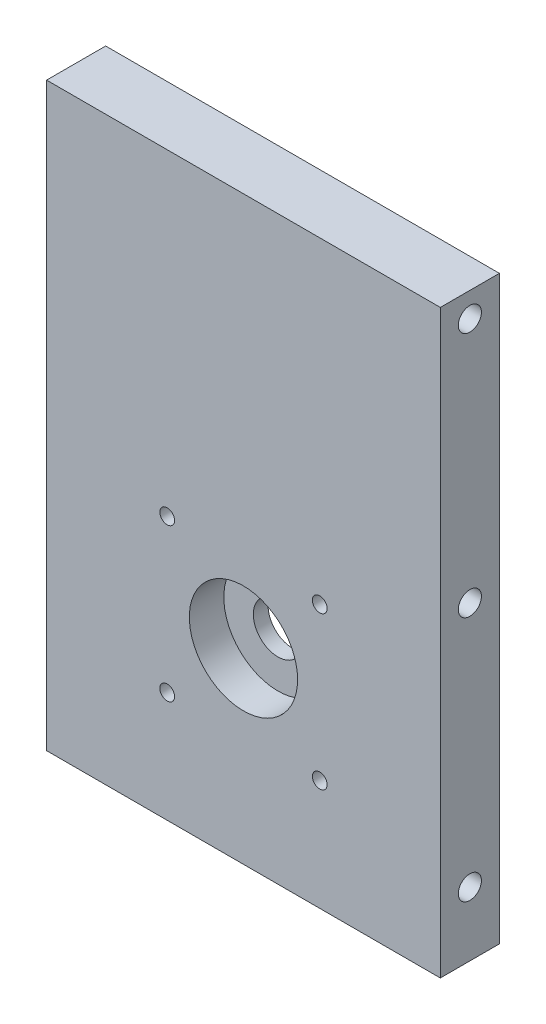
ISO-10303-21;
HEADER;
FILE_DESCRIPTION(('STEP AP214'),'2;1');
FILE_NAME('part.step','',(''),(''),'','','');
FILE_SCHEMA(('AUTOMOTIVE_DESIGN { 1 0 10303 214 1 1 1 1 }'));
ENDSEC;
DATA;
#1=APPLICATION_CONTEXT('core data for automotive mechanical design processes');
#2=APPLICATION_PROTOCOL_DEFINITION('international standard','automotive_design',2000,#1);
#3=PRODUCT_CONTEXT('',#1,'mechanical');
#4=PRODUCT('Part','Part','',(#3));
#5=PRODUCT_RELATED_PRODUCT_CATEGORY('part','',(#4));
#6=PRODUCT_DEFINITION_FORMATION('','',#4);
#7=PRODUCT_DEFINITION_CONTEXT('part definition',#1,'design');
#8=PRODUCT_DEFINITION('design','',#6,#7);
#9=PRODUCT_DEFINITION_SHAPE('','',#8);
#10=(LENGTH_UNIT() NAMED_UNIT(*) SI_UNIT(.MILLI.,.METRE.));
#11=(NAMED_UNIT(*) PLANE_ANGLE_UNIT() SI_UNIT($,.RADIAN.));
#12=(NAMED_UNIT(*) SI_UNIT($,.STERADIAN.) SOLID_ANGLE_UNIT());
#13=UNCERTAINTY_MEASURE_WITH_UNIT(LENGTH_MEASURE(1.E-05),#10,'distance_accuracy_value','');
#14=(GEOMETRIC_REPRESENTATION_CONTEXT(3) GLOBAL_UNCERTAINTY_ASSIGNED_CONTEXT((#13)) GLOBAL_UNIT_ASSIGNED_CONTEXT((#10,
#11,#12)) REPRESENTATION_CONTEXT('',''));
#15=CARTESIAN_POINT('',(0.,0.,0.));
#16=DIRECTION('',(0.,0.,1.));
#17=DIRECTION('',(1.,0.,0.));
#18=AXIS2_PLACEMENT_3D('',#15,#16,#17);
#19=CARTESIAN_POINT('',(40.,30.,12.));
#20=DIRECTION('',(0.,0.,-1.));
#21=DIRECTION('',(-1.,0.,0.));
#22=AXIS2_PLACEMENT_3D('',#19,#20,#21);
#23=CYLINDRICAL_SURFACE('',#22,5.);
#24=CARTESIAN_POINT('',(40.,30.,2.));
#25=DIRECTION('',(0.,0.,-1.));
#26=DIRECTION('',(-1.,0.,0.));
#27=AXIS2_PLACEMENT_3D('',#24,#25,#26);
#28=CIRCLE('',#27,5.);
#29=CARTESIAN_POINT('',(35.,30.,2.));
#30=VERTEX_POINT('',#29);
#31=EDGE_CURVE('E179',#30,#30,#28,.T.);
#32=ORIENTED_EDGE('',*,*,#31,.T.);
#33=EDGE_LOOP('',(#32));
#34=FACE_BOUND('',#33,.T.);
#35=CARTESIAN_POINT('',(40.,30.,5.));
#36=DIRECTION('',(0.,0.,1.));
#37=DIRECTION('',(1.,0.,0.));
#38=AXIS2_PLACEMENT_3D('',#35,#36,#37);
#39=CIRCLE('',#38,5.);
#40=CARTESIAN_POINT('',(45.,30.,5.));
#41=VERTEX_POINT('',#40);
#42=EDGE_CURVE('E49',#41,#41,#39,.T.);
#43=ORIENTED_EDGE('',*,*,#42,.T.);
#44=EDGE_LOOP('',(#43));
#45=FACE_BOUND('',#44,.T.);
#46=ADVANCED_FACE('F45',(#34,#45),#23,.F.);
#47=CARTESIAN_POINT('',(0.,0.,12.));
#48=DIRECTION('',(0.,0.,-1.));
#49=DIRECTION('',(-1.,0.,0.));
#50=AXIS2_PLACEMENT_3D('',#47,#48,#49);
#51=PLANE('',#50);
#52=CARTESIAN_POINT('',(40.,30.,12.));
#53=DIRECTION('',(0.,0.,1.));
#54=DIRECTION('',(1.,0.,0.));
#55=AXIS2_PLACEMENT_3D('',#52,#53,#54);
#56=CIRCLE('',#55,11.);
#57=CARTESIAN_POINT('',(51.,30.,12.));
#58=VERTEX_POINT('',#57);
#59=EDGE_CURVE('E105',#58,#58,#56,.T.);
#60=ORIENTED_EDGE('',*,*,#59,.F.);
#61=EDGE_LOOP('',(#60));
#62=FACE_BOUND('',#61,.T.);
#63=DIRECTION('',(0.,-1.,0.));
#64=VECTOR('',#63,1.);
#65=CARTESIAN_POINT('',(0.,0.,12.));
#66=LINE('',#65,#64);
#67=CARTESIAN_POINT('',(0.,110.,12.));
#68=VERTEX_POINT('',#67);
#69=CARTESIAN_POINT('',(0.,-8.00000000000001,12.));
#70=VERTEX_POINT('',#69);
#71=EDGE_CURVE('E96',#68,#70,#66,.T.);
#72=ORIENTED_EDGE('',*,*,#71,.T.);
#73=DIRECTION('',(1.,0.,0.));
#74=VECTOR('',#73,1.);
#75=CARTESIAN_POINT('',(80.,-8.,12.));
#76=LINE('',#75,#74);
#77=CARTESIAN_POINT('',(80.,-8.,12.));
#78=VERTEX_POINT('',#77);
#79=EDGE_CURVE('E102',#70,#78,#76,.T.);
#80=ORIENTED_EDGE('',*,*,#79,.T.);
#81=DIRECTION('',(0.,1.,0.));
#82=VECTOR('',#81,1.);
#83=CARTESIAN_POINT('',(80.,0.,12.));
#84=LINE('',#83,#82);
#85=CARTESIAN_POINT('',(80.,110.,12.));
#86=VERTEX_POINT('',#85);
#87=EDGE_CURVE('E89',#78,#86,#84,.T.);
#88=ORIENTED_EDGE('',*,*,#87,.T.);
#89=DIRECTION('',(-1.,0.,0.));
#90=VECTOR('',#89,1.);
#91=CARTESIAN_POINT('',(0.,110.,12.));
#92=LINE('',#91,#90);
#93=EDGE_CURVE('E65',#86,#68,#92,.T.);
#94=ORIENTED_EDGE('',*,*,#93,.T.);
#95=EDGE_LOOP('',(#72,#80,#88,#94));
#96=FACE_BOUND('',#95,.T.);
#97=CARTESIAN_POINT('',(55.5,45.5000000000001,12.));
#98=DIRECTION('',(0.,0.,1.));
#99=DIRECTION('',(1.,0.,0.));
#100=AXIS2_PLACEMENT_3D('',#97,#98,#99);
#101=CIRCLE('',#100,1.5);
#102=CARTESIAN_POINT('',(57.,45.5000000000001,12.));
#103=VERTEX_POINT('',#102);
#104=EDGE_CURVE('E208',#103,#103,#101,.T.);
#105=ORIENTED_EDGE('',*,*,#104,.F.);
#106=EDGE_LOOP('',(#105));
#107=FACE_BOUND('',#106,.T.);
#108=CARTESIAN_POINT('',(24.5,45.4999999999999,12.));
#109=DIRECTION('',(0.,0.,1.));
#110=DIRECTION('',(1.,0.,0.));
#111=AXIS2_PLACEMENT_3D('',#108,#109,#110);
#112=CIRCLE('',#111,1.5);
#113=CARTESIAN_POINT('',(26.,45.4999999999999,12.));
#114=VERTEX_POINT('',#113);
#115=EDGE_CURVE('E200',#114,#114,#112,.T.);
#116=ORIENTED_EDGE('',*,*,#115,.F.);
#117=EDGE_LOOP('',(#116));
#118=FACE_BOUND('',#117,.T.);
#119=CARTESIAN_POINT('',(24.5000000000003,14.4999999999999,12.));
#120=DIRECTION('',(0.,0.,1.));
#121=DIRECTION('',(1.,0.,0.));
#122=AXIS2_PLACEMENT_3D('',#119,#120,#121);
#123=CIRCLE('',#122,1.5);
#124=CARTESIAN_POINT('',(26.0000000000003,14.4999999999999,12.));
#125=VERTEX_POINT('',#124);
#126=EDGE_CURVE('E192',#125,#125,#123,.T.);
#127=ORIENTED_EDGE('',*,*,#126,.F.);
#128=EDGE_LOOP('',(#127));
#129=FACE_BOUND('',#128,.T.);
#130=CARTESIAN_POINT('',(55.5000000000003,14.5000000000001,12.));
#131=DIRECTION('',(0.,0.,1.));
#132=DIRECTION('',(1.,0.,0.));
#133=AXIS2_PLACEMENT_3D('',#130,#131,#132);
#134=CIRCLE('',#133,1.5);
#135=CARTESIAN_POINT('',(57.0000000000003,14.5000000000001,12.));
#136=VERTEX_POINT('',#135);
#137=EDGE_CURVE('E183',#136,#136,#134,.T.);
#138=ORIENTED_EDGE('',*,*,#137,.F.);
#139=EDGE_LOOP('',(#138));
#140=FACE_BOUND('',#139,.T.);
#141=ADVANCED_FACE('F108',(#62,#96,#107,#118,#129,#140),#51,.F.);
#142=CARTESIAN_POINT('',(0.,0.,0.));
#143=DIRECTION('',(0.,0.,-1.));
#144=DIRECTION('',(-1.,0.,0.));
#145=AXIS2_PLACEMENT_3D('',#142,#143,#144);
#146=PLANE('',#145);
#147=CARTESIAN_POINT('',(40.,30.,0.));
#148=DIRECTION('',(0.,0.,-1.));
#149=DIRECTION('',(-1.,0.,0.));
#150=AXIS2_PLACEMENT_3D('',#147,#148,#149);
#151=CIRCLE('',#150,11.25);
#152=CARTESIAN_POINT('',(28.75,30.,0.));
#153=VERTEX_POINT('',#152);
#154=EDGE_CURVE('E155',#153,#153,#151,.T.);
#155=ORIENTED_EDGE('',*,*,#154,.F.);
#156=EDGE_LOOP('',(#155));
#157=FACE_BOUND('',#156,.T.);
#158=CARTESIAN_POINT('',(24.5000000000003,14.4999999999999,0.));
#159=DIRECTION('',(0.,0.,1.));
#160=DIRECTION('',(1.,0.,0.));
#161=AXIS2_PLACEMENT_3D('',#158,#159,#160);
#162=CIRCLE('',#161,1.5);
#163=CARTESIAN_POINT('',(26.0000000000003,14.4999999999999,0.));
#164=VERTEX_POINT('',#163);
#165=EDGE_CURVE('E187',#164,#164,#162,.T.);
#166=ORIENTED_EDGE('',*,*,#165,.T.);
#167=EDGE_LOOP('',(#166));
#168=FACE_BOUND('',#167,.T.);
#169=CARTESIAN_POINT('',(55.5,45.5000000000001,0.));
#170=DIRECTION('',(0.,0.,1.));
#171=DIRECTION('',(1.,0.,0.));
#172=AXIS2_PLACEMENT_3D('',#169,#170,#171);
#173=CIRCLE('',#172,1.5);
#174=CARTESIAN_POINT('',(57.,45.5000000000001,0.));
#175=VERTEX_POINT('',#174);
#176=EDGE_CURVE('E204',#175,#175,#173,.T.);
#177=ORIENTED_EDGE('',*,*,#176,.T.);
#178=EDGE_LOOP('',(#177));
#179=FACE_BOUND('',#178,.T.);
#180=DIRECTION('',(0.,-1.,0.));
#181=VECTOR('',#180,1.);
#182=CARTESIAN_POINT('',(0.,0.,0.));
#183=LINE('',#182,#181);
#184=CARTESIAN_POINT('',(0.,110.,0.));
#185=VERTEX_POINT('',#184);
#186=CARTESIAN_POINT('',(0.,-8.00000000000001,0.));
#187=VERTEX_POINT('',#186);
#188=EDGE_CURVE('E212',#185,#187,#183,.T.);
#189=ORIENTED_EDGE('',*,*,#188,.F.);
#190=DIRECTION('',(-1.,0.,0.));
#191=VECTOR('',#190,1.);
#192=CARTESIAN_POINT('',(0.,110.,0.));
#193=LINE('',#192,#191);
#194=CARTESIAN_POINT('',(80.,110.,0.));
#195=VERTEX_POINT('',#194);
#196=EDGE_CURVE('E217',#195,#185,#193,.T.);
#197=ORIENTED_EDGE('',*,*,#196,.F.);
#198=DIRECTION('',(0.,1.,0.));
#199=VECTOR('',#198,1.);
#200=CARTESIAN_POINT('',(80.,0.,0.));
#201=LINE('',#200,#199);
#202=CARTESIAN_POINT('',(80.,-8.,0.));
#203=VERTEX_POINT('',#202);
#204=EDGE_CURVE('E76',#203,#195,#201,.T.);
#205=ORIENTED_EDGE('',*,*,#204,.F.);
#206=DIRECTION('',(1.,0.,0.));
#207=VECTOR('',#206,1.);
#208=CARTESIAN_POINT('',(80.,-8.,0.));
#209=LINE('',#208,#207);
#210=EDGE_CURVE('E103',#187,#203,#209,.T.);
#211=ORIENTED_EDGE('',*,*,#210,.F.);
#212=EDGE_LOOP('',(#189,#197,#205,#211));
#213=FACE_BOUND('',#212,.T.);
#214=CARTESIAN_POINT('',(24.5,45.4999999999999,0.));
#215=DIRECTION('',(0.,0.,1.));
#216=DIRECTION('',(1.,0.,0.));
#217=AXIS2_PLACEMENT_3D('',#214,#215,#216);
#218=CIRCLE('',#217,1.5);
#219=CARTESIAN_POINT('',(26.,45.4999999999999,0.));
#220=VERTEX_POINT('',#219);
#221=EDGE_CURVE('E196',#220,#220,#218,.T.);
#222=ORIENTED_EDGE('',*,*,#221,.T.);
#223=EDGE_LOOP('',(#222));
#224=FACE_BOUND('',#223,.T.);
#225=CARTESIAN_POINT('',(55.5000000000003,14.5000000000001,0.));
#226=DIRECTION('',(0.,0.,1.));
#227=DIRECTION('',(1.,0.,0.));
#228=AXIS2_PLACEMENT_3D('',#225,#226,#227);
#229=CIRCLE('',#228,1.5);
#230=CARTESIAN_POINT('',(57.0000000000003,14.5000000000001,0.));
#231=VERTEX_POINT('',#230);
#232=EDGE_CURVE('E188',#231,#231,#229,.T.);
#233=ORIENTED_EDGE('',*,*,#232,.T.);
#234=EDGE_LOOP('',(#233));
#235=FACE_BOUND('',#234,.T.);
#236=ADVANCED_FACE('F249',(#157,#168,#179,#213,#224,#235),#146,.T.);
#237=CARTESIAN_POINT('',(0.,0.,12.));
#238=DIRECTION('',(1.,0.,0.));
#239=DIRECTION('',(0.,1.,0.));
#240=AXIS2_PLACEMENT_3D('',#237,#238,#239);
#241=PLANE('',#240);
#242=CARTESIAN_POINT('',(0.,105.,6.));
#243=DIRECTION('',(-1.,0.,0.));
#244=DIRECTION('',(0.,-1.,0.));
#245=AXIS2_PLACEMENT_3D('',#242,#243,#244);
#246=CIRCLE('',#245,2.35);
#247=CARTESIAN_POINT('',(0.,102.65,6.));
#248=VERTEX_POINT('',#247);
#249=EDGE_CURVE('E131',#248,#248,#246,.T.);
#250=ORIENTED_EDGE('',*,*,#249,.F.);
#251=EDGE_LOOP('',(#250));
#252=FACE_BOUND('',#251,.T.);
#253=CARTESIAN_POINT('',(0.,55.,5.99999999999948));
#254=DIRECTION('',(-1.,0.,0.));
#255=DIRECTION('',(0.,-1.,0.));
#256=AXIS2_PLACEMENT_3D('',#253,#254,#255);
#257=CIRCLE('',#256,2.35);
#258=CARTESIAN_POINT('',(0.,52.65,5.99999999999948));
#259=VERTEX_POINT('',#258);
#260=EDGE_CURVE('E135',#259,#259,#257,.T.);
#261=ORIENTED_EDGE('',*,*,#260,.F.);
#262=EDGE_LOOP('',(#261));
#263=FACE_BOUND('',#262,.T.);
#264=CARTESIAN_POINT('',(0.,4.99999999999997,5.99999999999896));
#265=DIRECTION('',(-1.,0.,0.));
#266=DIRECTION('',(0.,-1.,0.));
#267=AXIS2_PLACEMENT_3D('',#264,#265,#266);
#268=CIRCLE('',#267,2.35);
#269=CARTESIAN_POINT('',(0.,2.64999999999997,5.99999999999896));
#270=VERTEX_POINT('',#269);
#271=EDGE_CURVE('E143',#270,#270,#268,.T.);
#272=ORIENTED_EDGE('',*,*,#271,.F.);
#273=EDGE_LOOP('',(#272));
#274=FACE_BOUND('',#273,.T.);
#275=ORIENTED_EDGE('',*,*,#188,.T.);
#276=DIRECTION('',(0.,0.,1.));
#277=VECTOR('',#276,1.);
#278=CARTESIAN_POINT('',(0.,-8.00000000000001,0.));
#279=LINE('',#278,#277);
#280=EDGE_CURVE('E106',#187,#70,#279,.T.);
#281=ORIENTED_EDGE('',*,*,#280,.T.);
#282=ORIENTED_EDGE('',*,*,#71,.F.);
#283=DIRECTION('',(0.,0.,-1.));
#284=VECTOR('',#283,1.);
#285=CARTESIAN_POINT('',(0.,110.,12.));
#286=LINE('',#285,#284);
#287=EDGE_CURVE('E56',#68,#185,#286,.T.);
#288=ORIENTED_EDGE('',*,*,#287,.T.);
#289=EDGE_LOOP('',(#275,#281,#282,#288));
#290=FACE_BOUND('',#289,.T.);
#291=ADVANCED_FACE('F47',(#252,#263,#274,#290),#241,.F.);
#292=CARTESIAN_POINT('',(80.,0.,12.));
#293=DIRECTION('',(-1.,0.,0.));
#294=DIRECTION('',(0.,-1.,0.));
#295=AXIS2_PLACEMENT_3D('',#292,#293,#294);
#296=PLANE('',#295);
#297=CARTESIAN_POINT('',(80.,105.,6.));
#298=DIRECTION('',(1.,0.,0.));
#299=DIRECTION('',(0.,1.,0.));
#300=AXIS2_PLACEMENT_3D('',#297,#298,#299);
#301=CIRCLE('',#300,2.35);
#302=CARTESIAN_POINT('',(80.,107.35,6.));
#303=VERTEX_POINT('',#302);
#304=EDGE_CURVE('E156',#303,#303,#301,.T.);
#305=ORIENTED_EDGE('',*,*,#304,.F.);
#306=EDGE_LOOP('',(#305));
#307=FACE_BOUND('',#306,.T.);
#308=CARTESIAN_POINT('',(80.,55.,5.99999999999948));
#309=DIRECTION('',(1.,0.,0.));
#310=DIRECTION('',(0.,1.,0.));
#311=AXIS2_PLACEMENT_3D('',#308,#309,#310);
#312=CIRCLE('',#311,2.35);
#313=CARTESIAN_POINT('',(80.,57.35,5.99999999999948));
#314=VERTEX_POINT('',#313);
#315=EDGE_CURVE('E160',#314,#314,#312,.T.);
#316=ORIENTED_EDGE('',*,*,#315,.F.);
#317=EDGE_LOOP('',(#316));
#318=FACE_BOUND('',#317,.T.);
#319=CARTESIAN_POINT('',(80.,4.99999999999999,5.99999999999896));
#320=DIRECTION('',(1.,0.,0.));
#321=DIRECTION('',(0.,1.,0.));
#322=AXIS2_PLACEMENT_3D('',#319,#320,#321);
#323=CIRCLE('',#322,2.35);
#324=CARTESIAN_POINT('',(80.,7.34999999999999,5.99999999999896));
#325=VERTEX_POINT('',#324);
#326=EDGE_CURVE('E168',#325,#325,#323,.T.);
#327=ORIENTED_EDGE('',*,*,#326,.F.);
#328=EDGE_LOOP('',(#327));
#329=FACE_BOUND('',#328,.T.);
#330=ORIENTED_EDGE('',*,*,#204,.T.);
#331=DIRECTION('',(0.,0.,-1.));
#332=VECTOR('',#331,1.);
#333=CARTESIAN_POINT('',(80.,110.,12.));
#334=LINE('',#333,#332);
#335=EDGE_CURVE('E11',#86,#195,#334,.T.);
#336=ORIENTED_EDGE('',*,*,#335,.F.);
#337=ORIENTED_EDGE('',*,*,#87,.F.);
#338=DIRECTION('',(0.,0.,1.));
#339=VECTOR('',#338,1.);
#340=CARTESIAN_POINT('',(80.,-8.,0.));
#341=LINE('',#340,#339);
#342=EDGE_CURVE('E92',#203,#78,#341,.T.);
#343=ORIENTED_EDGE('',*,*,#342,.F.);
#344=EDGE_LOOP('',(#330,#336,#337,#343));
#345=FACE_BOUND('',#344,.T.);
#346=ADVANCED_FACE('F91',(#307,#318,#329,#345),#296,.F.);
#347=CARTESIAN_POINT('',(0.,110.,12.));
#348=DIRECTION('',(0.,-1.,0.));
#349=DIRECTION('',(0.,0.,-1.));
#350=AXIS2_PLACEMENT_3D('',#347,#348,#349);
#351=PLANE('',#350);
#352=ORIENTED_EDGE('',*,*,#196,.T.);
#353=ORIENTED_EDGE('',*,*,#287,.F.);
#354=ORIENTED_EDGE('',*,*,#93,.F.);
#355=ORIENTED_EDGE('',*,*,#335,.T.);
#356=EDGE_LOOP('',(#352,#353,#354,#355));
#357=FACE_BOUND('',#356,.T.);
#358=ADVANCED_FACE('F285',(#357),#351,.F.);
#359=CARTESIAN_POINT('',(55.5,45.5000000000001,12.));
#360=DIRECTION('',(0.,0.,-1.));
#361=DIRECTION('',(-1.,0.,0.));
#362=AXIS2_PLACEMENT_3D('',#359,#360,#361);
#363=CYLINDRICAL_SURFACE('',#362,1.5);
#364=ORIENTED_EDGE('',*,*,#104,.T.);
#365=EDGE_LOOP('',(#364));
#366=FACE_BOUND('',#365,.T.);
#367=ORIENTED_EDGE('',*,*,#176,.F.);
#368=EDGE_LOOP('',(#367));
#369=FACE_BOUND('',#368,.T.);
#370=ADVANCED_FACE('F282',(#366,#369),#363,.F.);
#371=CARTESIAN_POINT('',(24.5,45.4999999999999,12.));
#372=DIRECTION('',(0.,0.,-1.));
#373=DIRECTION('',(-1.,0.,0.));
#374=AXIS2_PLACEMENT_3D('',#371,#372,#373);
#375=CYLINDRICAL_SURFACE('',#374,1.5);
#376=ORIENTED_EDGE('',*,*,#115,.T.);
#377=EDGE_LOOP('',(#376));
#378=FACE_BOUND('',#377,.T.);
#379=ORIENTED_EDGE('',*,*,#221,.F.);
#380=EDGE_LOOP('',(#379));
#381=FACE_BOUND('',#380,.T.);
#382=ADVANCED_FACE('F269',(#378,#381),#375,.F.);
#383=CARTESIAN_POINT('',(24.5000000000003,14.4999999999999,12.));
#384=DIRECTION('',(0.,0.,-1.));
#385=DIRECTION('',(-1.,0.,0.));
#386=AXIS2_PLACEMENT_3D('',#383,#384,#385);
#387=CYLINDRICAL_SURFACE('',#386,1.5);
#388=ORIENTED_EDGE('',*,*,#126,.T.);
#389=EDGE_LOOP('',(#388));
#390=FACE_BOUND('',#389,.T.);
#391=ORIENTED_EDGE('',*,*,#165,.F.);
#392=EDGE_LOOP('',(#391));
#393=FACE_BOUND('',#392,.T.);
#394=ADVANCED_FACE('F263',(#390,#393),#387,.F.);
#395=CARTESIAN_POINT('',(55.5000000000003,14.5000000000001,12.));
#396=DIRECTION('',(0.,0.,-1.));
#397=DIRECTION('',(-1.,0.,0.));
#398=AXIS2_PLACEMENT_3D('',#395,#396,#397);
#399=CYLINDRICAL_SURFACE('',#398,1.5);
#400=ORIENTED_EDGE('',*,*,#137,.T.);
#401=EDGE_LOOP('',(#400));
#402=FACE_BOUND('',#401,.T.);
#403=ORIENTED_EDGE('',*,*,#232,.F.);
#404=EDGE_LOOP('',(#403));
#405=FACE_BOUND('',#404,.T.);
#406=ADVANCED_FACE('F245',(#402,#405),#399,.F.);
#407=CARTESIAN_POINT('',(40.,30.,2.));
#408=DIRECTION('',(0.,0.,-1.));
#409=DIRECTION('',(-1.,0.,0.));
#410=AXIS2_PLACEMENT_3D('',#407,#408,#409);
#411=CYLINDRICAL_SURFACE('',#410,11.25);
#412=CARTESIAN_POINT('',(40.,30.,2.));
#413=DIRECTION('',(0.,0.,-1.));
#414=DIRECTION('',(-1.,0.,0.));
#415=AXIS2_PLACEMENT_3D('',#412,#413,#414);
#416=CIRCLE('',#415,11.25);
#417=CARTESIAN_POINT('',(28.75,30.,2.));
#418=VERTEX_POINT('',#417);
#419=EDGE_CURVE('E175',#418,#418,#416,.T.);
#420=ORIENTED_EDGE('',*,*,#419,.F.);
#421=EDGE_LOOP('',(#420));
#422=FACE_BOUND('',#421,.T.);
#423=ORIENTED_EDGE('',*,*,#154,.T.);
#424=EDGE_LOOP('',(#423));
#425=FACE_BOUND('',#424,.T.);
#426=ADVANCED_FACE('F239',(#422,#425),#411,.F.);
#427=CARTESIAN_POINT('',(40.,30.,2.));
#428=DIRECTION('',(0.,0.,-1.));
#429=DIRECTION('',(-1.,0.,0.));
#430=AXIS2_PLACEMENT_3D('',#427,#428,#429);
#431=PLANE('',#430);
#432=ORIENTED_EDGE('',*,*,#31,.F.);
#433=EDGE_LOOP('',(#432));
#434=FACE_BOUND('',#433,.T.);
#435=ORIENTED_EDGE('',*,*,#419,.T.);
#436=EDGE_LOOP('',(#435));
#437=FACE_BOUND('',#436,.T.);
#438=ADVANCED_FACE('F235',(#434,#437),#431,.T.);
#439=CARTESIAN_POINT('',(75.,4.99999999999999,5.99999999999896));
#440=DIRECTION('',(1.,0.,0.));
#441=DIRECTION('',(0.,1.,0.));
#442=AXIS2_PLACEMENT_3D('',#439,#440,#441);
#443=CYLINDRICAL_SURFACE('',#442,2.35);
#444=CARTESIAN_POINT('',(75.,4.99999999999999,5.99999999999896));
#445=DIRECTION('',(1.,0.,0.));
#446=DIRECTION('',(0.,1.,0.));
#447=AXIS2_PLACEMENT_3D('',#444,#445,#446);
#448=CIRCLE('',#447,2.35);
#449=CARTESIAN_POINT('',(75.,7.34999999999999,5.99999999999896));
#450=VERTEX_POINT('',#449);
#451=EDGE_CURVE('E130',#450,#450,#448,.T.);
#452=ORIENTED_EDGE('',*,*,#451,.F.);
#453=EDGE_LOOP('',(#452));
#454=FACE_BOUND('',#453,.T.);
#455=ORIENTED_EDGE('',*,*,#326,.T.);
#456=EDGE_LOOP('',(#455));
#457=FACE_BOUND('',#456,.T.);
#458=ADVANCED_FACE('F238',(#454,#457),#443,.F.);
#459=CARTESIAN_POINT('',(75.,4.99999999999999,5.99999999999896));
#460=DIRECTION('',(1.,0.,0.));
#461=DIRECTION('',(0.,1.,0.));
#462=AXIS2_PLACEMENT_3D('',#459,#460,#461);
#463=PLANE('',#462);
#464=ORIENTED_EDGE('',*,*,#451,.T.);
#465=EDGE_LOOP('',(#464));
#466=FACE_BOUND('',#465,.T.);
#467=ADVANCED_FACE('F302',(#466),#463,.T.);
#468=CARTESIAN_POINT('',(75.,55.,5.99999999999948));
#469=DIRECTION('',(1.,0.,0.));
#470=DIRECTION('',(0.,1.,0.));
#471=AXIS2_PLACEMENT_3D('',#468,#469,#470);
#472=CYLINDRICAL_SURFACE('',#471,2.35);
#473=CARTESIAN_POINT('',(75.,55.,5.99999999999948));
#474=DIRECTION('',(1.,0.,0.));
#475=DIRECTION('',(0.,1.,0.));
#476=AXIS2_PLACEMENT_3D('',#473,#474,#475);
#477=CIRCLE('',#476,2.35);
#478=CARTESIAN_POINT('',(75.,57.35,5.99999999999948));
#479=VERTEX_POINT('',#478);
#480=EDGE_CURVE('E164',#479,#479,#477,.T.);
#481=ORIENTED_EDGE('',*,*,#480,.F.);
#482=EDGE_LOOP('',(#481));
#483=FACE_BOUND('',#482,.T.);
#484=ORIENTED_EDGE('',*,*,#315,.T.);
#485=EDGE_LOOP('',(#484));
#486=FACE_BOUND('',#485,.T.);
#487=ADVANCED_FACE('F308',(#483,#486),#472,.F.);
#488=CARTESIAN_POINT('',(75.,55.,5.99999999999948));
#489=DIRECTION('',(1.,0.,0.));
#490=DIRECTION('',(0.,1.,0.));
#491=AXIS2_PLACEMENT_3D('',#488,#489,#490);
#492=PLANE('',#491);
#493=ORIENTED_EDGE('',*,*,#480,.T.);
#494=EDGE_LOOP('',(#493));
#495=FACE_BOUND('',#494,.T.);
#496=ADVANCED_FACE('F313',(#495),#492,.T.);
#497=CARTESIAN_POINT('',(75.,105.,6.));
#498=DIRECTION('',(1.,0.,0.));
#499=DIRECTION('',(0.,1.,0.));
#500=AXIS2_PLACEMENT_3D('',#497,#498,#499);
#501=CYLINDRICAL_SURFACE('',#500,2.35);
#502=CARTESIAN_POINT('',(75.,105.,6.));
#503=DIRECTION('',(1.,0.,0.));
#504=DIRECTION('',(0.,1.,0.));
#505=AXIS2_PLACEMENT_3D('',#502,#503,#504);
#506=CIRCLE('',#505,2.35);
#507=CARTESIAN_POINT('',(75.,107.35,6.));
#508=VERTEX_POINT('',#507);
#509=EDGE_CURVE('E151',#508,#508,#506,.T.);
#510=ORIENTED_EDGE('',*,*,#509,.F.);
#511=EDGE_LOOP('',(#510));
#512=FACE_BOUND('',#511,.T.);
#513=ORIENTED_EDGE('',*,*,#304,.T.);
#514=EDGE_LOOP('',(#513));
#515=FACE_BOUND('',#514,.T.);
#516=ADVANCED_FACE('F316',(#512,#515),#501,.F.);
#517=CARTESIAN_POINT('',(75.,105.,6.));
#518=DIRECTION('',(1.,0.,0.));
#519=DIRECTION('',(0.,1.,0.));
#520=AXIS2_PLACEMENT_3D('',#517,#518,#519);
#521=PLANE('',#520);
#522=ORIENTED_EDGE('',*,*,#509,.T.);
#523=EDGE_LOOP('',(#522));
#524=FACE_BOUND('',#523,.T.);
#525=ADVANCED_FACE('F323',(#524),#521,.T.);
#526=CARTESIAN_POINT('',(5.,4.99999999999997,5.99999999999896));
#527=DIRECTION('',(-1.,0.,0.));
#528=DIRECTION('',(0.,-1.,0.));
#529=AXIS2_PLACEMENT_3D('',#526,#527,#528);
#530=CYLINDRICAL_SURFACE('',#529,2.35);
#531=CARTESIAN_POINT('',(5.,4.99999999999997,5.99999999999896));
#532=DIRECTION('',(-1.,0.,0.));
#533=DIRECTION('',(0.,-1.,0.));
#534=AXIS2_PLACEMENT_3D('',#531,#532,#533);
#535=CIRCLE('',#534,2.35);
#536=CARTESIAN_POINT('',(5.,2.64999999999997,5.99999999999896));
#537=VERTEX_POINT('',#536);
#538=EDGE_CURVE('E147',#537,#537,#535,.T.);
#539=ORIENTED_EDGE('',*,*,#538,.F.);
#540=EDGE_LOOP('',(#539));
#541=FACE_BOUND('',#540,.T.);
#542=ORIENTED_EDGE('',*,*,#271,.T.);
#543=EDGE_LOOP('',(#542));
#544=FACE_BOUND('',#543,.T.);
#545=ADVANCED_FACE('F327',(#541,#544),#530,.F.);
#546=CARTESIAN_POINT('',(5.,4.99999999999997,5.99999999999896));
#547=DIRECTION('',(-1.,0.,0.));
#548=DIRECTION('',(0.,-1.,0.));
#549=AXIS2_PLACEMENT_3D('',#546,#547,#548);
#550=PLANE('',#549);
#551=ORIENTED_EDGE('',*,*,#538,.T.);
#552=EDGE_LOOP('',(#551));
#553=FACE_BOUND('',#552,.T.);
#554=ADVANCED_FACE('F329',(#553),#550,.T.);
#555=CARTESIAN_POINT('',(4.99999999999999,55.,5.99999999999948));
#556=DIRECTION('',(-1.,0.,0.));
#557=DIRECTION('',(0.,-1.,0.));
#558=AXIS2_PLACEMENT_3D('',#555,#556,#557);
#559=CYLINDRICAL_SURFACE('',#558,2.35);
#560=CARTESIAN_POINT('',(4.99999999999999,55.,5.99999999999948));
#561=DIRECTION('',(-1.,0.,0.));
#562=DIRECTION('',(0.,-1.,0.));
#563=AXIS2_PLACEMENT_3D('',#560,#561,#562);
#564=CIRCLE('',#563,2.35);
#565=CARTESIAN_POINT('',(4.99999999999999,52.65,5.99999999999948));
#566=VERTEX_POINT('',#565);
#567=EDGE_CURVE('E139',#566,#566,#564,.T.);
#568=ORIENTED_EDGE('',*,*,#567,.F.);
#569=EDGE_LOOP('',(#568));
#570=FACE_BOUND('',#569,.T.);
#571=ORIENTED_EDGE('',*,*,#260,.T.);
#572=EDGE_LOOP('',(#571));
#573=FACE_BOUND('',#572,.T.);
#574=ADVANCED_FACE('F332',(#570,#573),#559,.F.);
#575=CARTESIAN_POINT('',(4.99999999999999,55.,5.99999999999948));
#576=DIRECTION('',(-1.,0.,0.));
#577=DIRECTION('',(0.,-1.,0.));
#578=AXIS2_PLACEMENT_3D('',#575,#576,#577);
#579=PLANE('',#578);
#580=ORIENTED_EDGE('',*,*,#567,.T.);
#581=EDGE_LOOP('',(#580));
#582=FACE_BOUND('',#581,.T.);
#583=ADVANCED_FACE('F337',(#582),#579,.T.);
#584=CARTESIAN_POINT('',(4.99999999999997,105.,6.));
#585=DIRECTION('',(-1.,0.,0.));
#586=DIRECTION('',(0.,-1.,0.));
#587=AXIS2_PLACEMENT_3D('',#584,#585,#586);
#588=CYLINDRICAL_SURFACE('',#587,2.35);
#589=CARTESIAN_POINT('',(4.99999999999997,105.,6.));
#590=DIRECTION('',(-1.,0.,0.));
#591=DIRECTION('',(0.,-1.,0.));
#592=AXIS2_PLACEMENT_3D('',#589,#590,#591);
#593=CIRCLE('',#592,2.35);
#594=CARTESIAN_POINT('',(4.99999999999997,102.65,6.));
#595=VERTEX_POINT('',#594);
#596=EDGE_CURVE('E126',#595,#595,#593,.T.);
#597=ORIENTED_EDGE('',*,*,#596,.F.);
#598=EDGE_LOOP('',(#597));
#599=FACE_BOUND('',#598,.T.);
#600=ORIENTED_EDGE('',*,*,#249,.T.);
#601=EDGE_LOOP('',(#600));
#602=FACE_BOUND('',#601,.T.);
#603=ADVANCED_FACE('F340',(#599,#602),#588,.F.);
#604=CARTESIAN_POINT('',(4.99999999999997,105.,6.));
#605=DIRECTION('',(-1.,0.,0.));
#606=DIRECTION('',(0.,-1.,0.));
#607=AXIS2_PLACEMENT_3D('',#604,#605,#606);
#608=PLANE('',#607);
#609=ORIENTED_EDGE('',*,*,#596,.T.);
#610=EDGE_LOOP('',(#609));
#611=FACE_BOUND('',#610,.T.);
#612=ADVANCED_FACE('F347',(#611),#608,.T.);
#613=CARTESIAN_POINT('',(40.,30.,5.));
#614=DIRECTION('',(0.,0.,1.));
#615=DIRECTION('',(1.,0.,0.));
#616=AXIS2_PLACEMENT_3D('',#613,#614,#615);
#617=CYLINDRICAL_SURFACE('',#616,11.);
#618=CARTESIAN_POINT('',(40.,30.,5.));
#619=DIRECTION('',(0.,0.,1.));
#620=DIRECTION('',(1.,0.,0.));
#621=AXIS2_PLACEMENT_3D('',#618,#619,#620);
#622=CIRCLE('',#621,11.);
#623=CARTESIAN_POINT('',(51.,30.,5.));
#624=VERTEX_POINT('',#623);
#625=EDGE_CURVE('E119',#624,#624,#622,.T.);
#626=ORIENTED_EDGE('',*,*,#625,.F.);
#627=EDGE_LOOP('',(#626));
#628=FACE_BOUND('',#627,.T.);
#629=ORIENTED_EDGE('',*,*,#59,.T.);
#630=EDGE_LOOP('',(#629));
#631=FACE_BOUND('',#630,.T.);
#632=ADVANCED_FACE('F350',(#628,#631),#617,.F.);
#633=CARTESIAN_POINT('',(40.,30.,5.));
#634=DIRECTION('',(0.,0.,1.));
#635=DIRECTION('',(1.,0.,0.));
#636=AXIS2_PLACEMENT_3D('',#633,#634,#635);
#637=PLANE('',#636);
#638=ORIENTED_EDGE('',*,*,#42,.F.);
#639=EDGE_LOOP('',(#638));
#640=FACE_BOUND('',#639,.T.);
#641=ORIENTED_EDGE('',*,*,#625,.T.);
#642=EDGE_LOOP('',(#641));
#643=FACE_BOUND('',#642,.T.);
#644=ADVANCED_FACE('F353',(#640,#643),#637,.T.);
#645=CARTESIAN_POINT('',(80.,-8.,0.));
#646=DIRECTION('',(0.,-1.,0.));
#647=DIRECTION('',(1.,0.,0.));
#648=AXIS2_PLACEMENT_3D('',#645,#646,#647);
#649=PLANE('',#648);
#650=ORIENTED_EDGE('',*,*,#79,.F.);
#651=ORIENTED_EDGE('',*,*,#280,.F.);
#652=ORIENTED_EDGE('',*,*,#210,.T.);
#653=ORIENTED_EDGE('',*,*,#342,.T.);
#654=EDGE_LOOP('',(#650,#651,#652,#653));
#655=FACE_BOUND('',#654,.T.);
#656=ADVANCED_FACE('F100',(#655),#649,.T.);
#657=CLOSED_SHELL('',(#46,#141,#236,#291,#346,#358,#370,#382,#394,#406,#426,#438,#458,#467,#487,
#496,#516,#525,#545,#554,#574,#583,#603,#612,#632,#644,#656));
#658=MANIFOLD_SOLID_BREP('B2',#657);
#659=ADVANCED_BREP_SHAPE_REPRESENTATION('',(#18,#658),#14);
#660=SHAPE_DEFINITION_REPRESENTATION(#9,#659);
ENDSEC;
END-ISO-10303-21;
